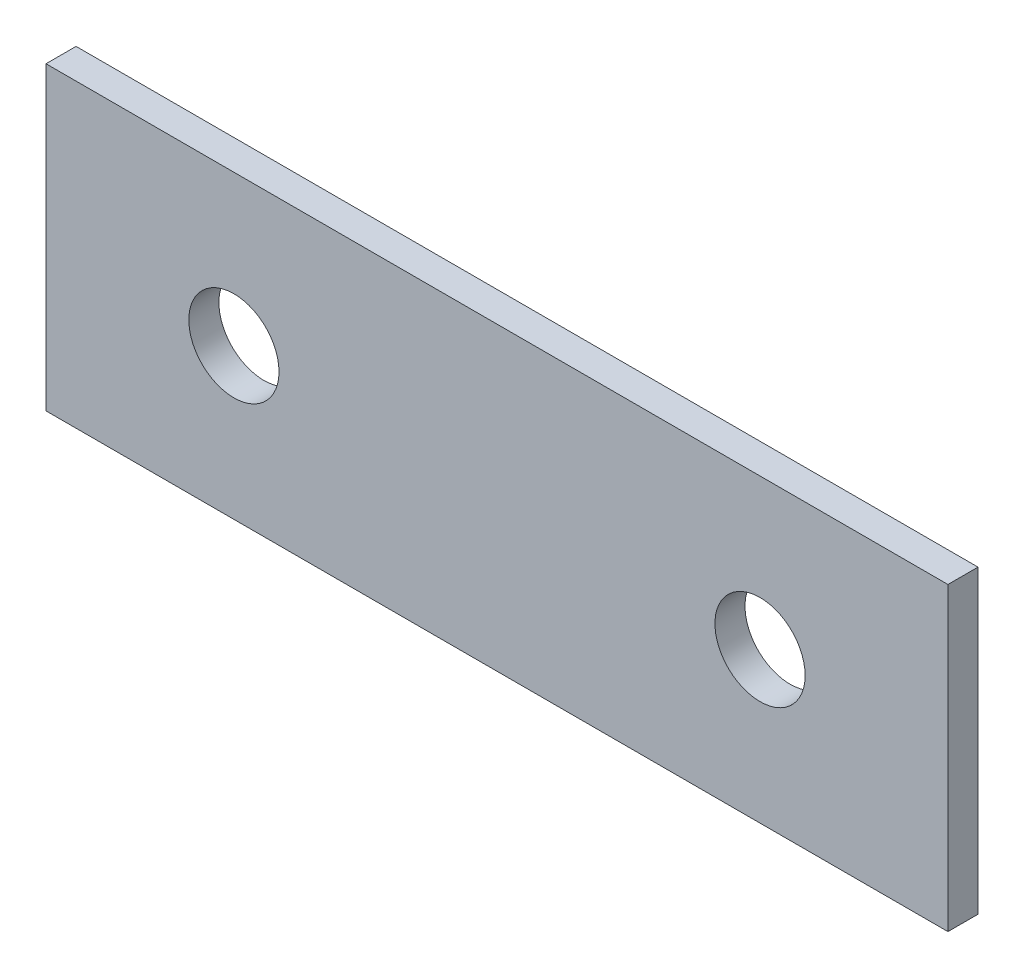
ISO-10303-21;
HEADER;
FILE_DESCRIPTION(('STEP AP214'),'2;1');
FILE_NAME('part.step','',(''),(''),'','','');
FILE_SCHEMA(('AUTOMOTIVE_DESIGN { 1 0 10303 214 1 1 1 1 }'));
ENDSEC;
DATA;
#1=APPLICATION_CONTEXT('core data for automotive mechanical design processes');
#2=APPLICATION_PROTOCOL_DEFINITION('international standard','automotive_design',2000,#1);
#3=PRODUCT_CONTEXT('',#1,'mechanical');
#4=PRODUCT('Part','Part','',(#3));
#5=PRODUCT_RELATED_PRODUCT_CATEGORY('part','',(#4));
#6=PRODUCT_DEFINITION_FORMATION('','',#4);
#7=PRODUCT_DEFINITION_CONTEXT('part definition',#1,'design');
#8=PRODUCT_DEFINITION('design','',#6,#7);
#9=PRODUCT_DEFINITION_SHAPE('','',#8);
#10=(LENGTH_UNIT() NAMED_UNIT(*) SI_UNIT(.MILLI.,.METRE.));
#11=(NAMED_UNIT(*) PLANE_ANGLE_UNIT() SI_UNIT($,.RADIAN.));
#12=(NAMED_UNIT(*) SI_UNIT($,.STERADIAN.) SOLID_ANGLE_UNIT());
#13=UNCERTAINTY_MEASURE_WITH_UNIT(LENGTH_MEASURE(1.E-05),#10,'distance_accuracy_value','');
#14=(GEOMETRIC_REPRESENTATION_CONTEXT(3) GLOBAL_UNCERTAINTY_ASSIGNED_CONTEXT((#13)) GLOBAL_UNIT_ASSIGNED_CONTEXT((#10,
#11,#12)) REPRESENTATION_CONTEXT('',''));
#15=CARTESIAN_POINT('',(0.,0.,0.));
#16=DIRECTION('',(0.,0.,1.));
#17=DIRECTION('',(1.,0.,0.));
#18=AXIS2_PLACEMENT_3D('',#15,#16,#17);
#19=CARTESIAN_POINT('',(-15.,-5.,1.));
#20=DIRECTION('',(0.,0.,1.));
#21=DIRECTION('',(1.,0.,0.));
#22=AXIS2_PLACEMENT_3D('',#19,#20,#21);
#23=PLANE('',#22);
#24=CARTESIAN_POINT('',(-8.75,0.,1.));
#25=DIRECTION('',(0.,0.,1.));
#26=DIRECTION('',(1.,0.,0.));
#27=AXIS2_PLACEMENT_3D('',#24,#25,#26);
#28=CIRCLE('',#27,1.5);
#29=CARTESIAN_POINT('',(-7.25,0.,1.));
#30=VERTEX_POINT('',#29);
#31=EDGE_CURVE('E98',#30,#30,#28,.T.);
#32=ORIENTED_EDGE('',*,*,#31,.F.);
#33=EDGE_LOOP('',(#32));
#34=FACE_BOUND('',#33,.T.);
#35=DIRECTION('',(0.,-1.,0.));
#36=VECTOR('',#35,1.);
#37=CARTESIAN_POINT('',(-15.,5.,1.));
#38=LINE('',#37,#36);
#39=CARTESIAN_POINT('',(-15.,5.,1.));
#40=VERTEX_POINT('',#39);
#41=CARTESIAN_POINT('',(-15.,-5.,1.));
#42=VERTEX_POINT('',#41);
#43=EDGE_CURVE('E83',#40,#42,#38,.T.);
#44=ORIENTED_EDGE('',*,*,#43,.T.);
#45=DIRECTION('',(1.,0.,0.));
#46=VECTOR('',#45,1.);
#47=CARTESIAN_POINT('',(-15.,-5.,1.));
#48=LINE('',#47,#46);
#49=CARTESIAN_POINT('',(15.,-5.,1.));
#50=VERTEX_POINT('',#49);
#51=EDGE_CURVE('E78',#42,#50,#48,.T.);
#52=ORIENTED_EDGE('',*,*,#51,.T.);
#53=DIRECTION('',(0.,1.,0.));
#54=VECTOR('',#53,1.);
#55=CARTESIAN_POINT('',(15.,5.,1.));
#56=LINE('',#55,#54);
#57=CARTESIAN_POINT('',(15.,5.,1.));
#58=VERTEX_POINT('',#57);
#59=EDGE_CURVE('E81',#50,#58,#56,.T.);
#60=ORIENTED_EDGE('',*,*,#59,.T.);
#61=DIRECTION('',(-1.,0.,0.));
#62=VECTOR('',#61,1.);
#63=CARTESIAN_POINT('',(-15.,5.,1.));
#64=LINE('',#63,#62);
#65=EDGE_CURVE('E48',#58,#40,#64,.T.);
#66=ORIENTED_EDGE('',*,*,#65,.T.);
#67=EDGE_LOOP('',(#44,#52,#60,#66));
#68=FACE_BOUND('',#67,.T.);
#69=CARTESIAN_POINT('',(8.75,0.,1.));
#70=DIRECTION('',(0.,0.,1.));
#71=DIRECTION('',(1.,0.,0.));
#72=AXIS2_PLACEMENT_3D('',#69,#70,#71);
#73=CIRCLE('',#72,1.5);
#74=CARTESIAN_POINT('',(10.25,0.,1.));
#75=VERTEX_POINT('',#74);
#76=EDGE_CURVE('E113',#75,#75,#73,.T.);
#77=ORIENTED_EDGE('',*,*,#76,.F.);
#78=EDGE_LOOP('',(#77));
#79=FACE_BOUND('',#78,.T.);
#80=ADVANCED_FACE('F31',(#34,#68,#79),#23,.T.);
#81=CARTESIAN_POINT('',(-15.,-5.,0.));
#82=DIRECTION('',(0.,0.,1.));
#83=DIRECTION('',(1.,0.,0.));
#84=AXIS2_PLACEMENT_3D('',#81,#82,#83);
#85=PLANE('',#84);
#86=CARTESIAN_POINT('',(-8.75,0.,0.));
#87=DIRECTION('',(0.,0.,1.));
#88=DIRECTION('',(1.,0.,0.));
#89=AXIS2_PLACEMENT_3D('',#86,#87,#88);
#90=CIRCLE('',#89,1.5);
#91=CARTESIAN_POINT('',(-7.25,0.,0.));
#92=VERTEX_POINT('',#91);
#93=EDGE_CURVE('E110',#92,#92,#90,.T.);
#94=ORIENTED_EDGE('',*,*,#93,.T.);
#95=EDGE_LOOP('',(#94));
#96=FACE_BOUND('',#95,.T.);
#97=DIRECTION('',(0.,-1.,0.));
#98=VECTOR('',#97,1.);
#99=CARTESIAN_POINT('',(-15.,5.,0.));
#100=LINE('',#99,#98);
#101=CARTESIAN_POINT('',(-15.,5.,0.));
#102=VERTEX_POINT('',#101);
#103=CARTESIAN_POINT('',(-15.,-5.,0.));
#104=VERTEX_POINT('',#103);
#105=EDGE_CURVE('E95',#102,#104,#100,.T.);
#106=ORIENTED_EDGE('',*,*,#105,.F.);
#107=DIRECTION('',(-1.,0.,0.));
#108=VECTOR('',#107,1.);
#109=CARTESIAN_POINT('',(-15.,5.,0.));
#110=LINE('',#109,#108);
#111=CARTESIAN_POINT('',(15.,5.,0.));
#112=VERTEX_POINT('',#111);
#113=EDGE_CURVE('E71',#112,#102,#110,.T.);
#114=ORIENTED_EDGE('',*,*,#113,.F.);
#115=DIRECTION('',(0.,1.,0.));
#116=VECTOR('',#115,1.);
#117=CARTESIAN_POINT('',(15.,5.,0.));
#118=LINE('',#117,#116);
#119=CARTESIAN_POINT('',(15.,-5.,0.));
#120=VERTEX_POINT('',#119);
#121=EDGE_CURVE('E65',#120,#112,#118,.T.);
#122=ORIENTED_EDGE('',*,*,#121,.F.);
#123=DIRECTION('',(1.,0.,0.));
#124=VECTOR('',#123,1.);
#125=CARTESIAN_POINT('',(-15.,-5.,0.));
#126=LINE('',#125,#124);
#127=EDGE_CURVE('E87',#104,#120,#126,.T.);
#128=ORIENTED_EDGE('',*,*,#127,.F.);
#129=EDGE_LOOP('',(#106,#114,#122,#128));
#130=FACE_BOUND('',#129,.T.);
#131=CARTESIAN_POINT('',(8.75,0.,0.));
#132=DIRECTION('',(0.,0.,1.));
#133=DIRECTION('',(1.,0.,0.));
#134=AXIS2_PLACEMENT_3D('',#131,#132,#133);
#135=CIRCLE('',#134,1.5);
#136=CARTESIAN_POINT('',(10.25,0.,0.));
#137=VERTEX_POINT('',#136);
#138=EDGE_CURVE('E116',#137,#137,#135,.T.);
#139=ORIENTED_EDGE('',*,*,#138,.T.);
#140=EDGE_LOOP('',(#139));
#141=FACE_BOUND('',#140,.T.);
#142=ADVANCED_FACE('F106',(#96,#130,#141),#85,.F.);
#143=CARTESIAN_POINT('',(-15.,5.,1.));
#144=DIRECTION('',(1.,0.,0.));
#145=DIRECTION('',(0.,0.,-1.));
#146=AXIS2_PLACEMENT_3D('',#143,#144,#145);
#147=PLANE('',#146);
#148=ORIENTED_EDGE('',*,*,#105,.T.);
#149=DIRECTION('',(0.,0.,-1.));
#150=VECTOR('',#149,1.);
#151=CARTESIAN_POINT('',(-15.,-5.,1.));
#152=LINE('',#151,#150);
#153=EDGE_CURVE('E11',#42,#104,#152,.T.);
#154=ORIENTED_EDGE('',*,*,#153,.F.);
#155=ORIENTED_EDGE('',*,*,#43,.F.);
#156=DIRECTION('',(0.,0.,-1.));
#157=VECTOR('',#156,1.);
#158=CARTESIAN_POINT('',(-15.,5.,1.));
#159=LINE('',#158,#157);
#160=EDGE_CURVE('E91',#40,#102,#159,.T.);
#161=ORIENTED_EDGE('',*,*,#160,.T.);
#162=EDGE_LOOP('',(#148,#154,#155,#161));
#163=FACE_BOUND('',#162,.T.);
#164=ADVANCED_FACE('F33',(#163),#147,.F.);
#165=CARTESIAN_POINT('',(-15.,-5.,1.));
#166=DIRECTION('',(0.,1.,0.));
#167=DIRECTION('',(0.,0.,1.));
#168=AXIS2_PLACEMENT_3D('',#165,#166,#167);
#169=PLANE('',#168);
#170=ORIENTED_EDGE('',*,*,#127,.T.);
#171=DIRECTION('',(0.,0.,-1.));
#172=VECTOR('',#171,1.);
#173=CARTESIAN_POINT('',(15.,-5.,1.));
#174=LINE('',#173,#172);
#175=EDGE_CURVE('E40',#50,#120,#174,.T.);
#176=ORIENTED_EDGE('',*,*,#175,.F.);
#177=ORIENTED_EDGE('',*,*,#51,.F.);
#178=ORIENTED_EDGE('',*,*,#153,.T.);
#179=EDGE_LOOP('',(#170,#176,#177,#178));
#180=FACE_BOUND('',#179,.T.);
#181=ADVANCED_FACE('F86',(#180),#169,.F.);
#182=CARTESIAN_POINT('',(15.,5.,1.));
#183=DIRECTION('',(-1.,0.,0.));
#184=DIRECTION('',(0.,-1.,0.));
#185=AXIS2_PLACEMENT_3D('',#182,#183,#184);
#186=PLANE('',#185);
#187=ORIENTED_EDGE('',*,*,#121,.T.);
#188=DIRECTION('',(0.,0.,-1.));
#189=VECTOR('',#188,1.);
#190=CARTESIAN_POINT('',(15.,5.,1.));
#191=LINE('',#190,#189);
#192=EDGE_CURVE('E88',#58,#112,#191,.T.);
#193=ORIENTED_EDGE('',*,*,#192,.F.);
#194=ORIENTED_EDGE('',*,*,#59,.F.);
#195=ORIENTED_EDGE('',*,*,#175,.T.);
#196=EDGE_LOOP('',(#187,#193,#194,#195));
#197=FACE_BOUND('',#196,.T.);
#198=ADVANCED_FACE('F89',(#197),#186,.F.);
#199=CARTESIAN_POINT('',(-15.,5.,1.));
#200=DIRECTION('',(0.,-1.,0.));
#201=DIRECTION('',(0.,0.,-1.));
#202=AXIS2_PLACEMENT_3D('',#199,#200,#201);
#203=PLANE('',#202);
#204=ORIENTED_EDGE('',*,*,#113,.T.);
#205=ORIENTED_EDGE('',*,*,#160,.F.);
#206=ORIENTED_EDGE('',*,*,#65,.F.);
#207=ORIENTED_EDGE('',*,*,#192,.T.);
#208=EDGE_LOOP('',(#204,#205,#206,#207));
#209=FACE_BOUND('',#208,.T.);
#210=ADVANCED_FACE('F103',(#209),#203,.F.);
#211=CARTESIAN_POINT('',(-8.75,0.,1.));
#212=DIRECTION('',(0.,0.,-1.));
#213=DIRECTION('',(-1.,0.,0.));
#214=AXIS2_PLACEMENT_3D('',#211,#212,#213);
#215=CYLINDRICAL_SURFACE('',#214,1.5);
#216=ORIENTED_EDGE('',*,*,#31,.T.);
#217=EDGE_LOOP('',(#216));
#218=FACE_BOUND('',#217,.T.);
#219=ORIENTED_EDGE('',*,*,#93,.F.);
#220=EDGE_LOOP('',(#219));
#221=FACE_BOUND('',#220,.T.);
#222=ADVANCED_FACE('F134',(#218,#221),#215,.F.);
#223=CARTESIAN_POINT('',(8.75,0.,1.));
#224=DIRECTION('',(0.,0.,-1.));
#225=DIRECTION('',(-1.,0.,0.));
#226=AXIS2_PLACEMENT_3D('',#223,#224,#225);
#227=CYLINDRICAL_SURFACE('',#226,1.5);
#228=ORIENTED_EDGE('',*,*,#76,.T.);
#229=EDGE_LOOP('',(#228));
#230=FACE_BOUND('',#229,.T.);
#231=ORIENTED_EDGE('',*,*,#138,.F.);
#232=EDGE_LOOP('',(#231));
#233=FACE_BOUND('',#232,.T.);
#234=ADVANCED_FACE('F122',(#230,#233),#227,.F.);
#235=CLOSED_SHELL('',(#80,#142,#164,#181,#198,#210,#222,#234));
#236=MANIFOLD_SOLID_BREP('B2',#235);
#237=ADVANCED_BREP_SHAPE_REPRESENTATION('',(#18,#236),#14);
#238=SHAPE_DEFINITION_REPRESENTATION(#9,#237);
ENDSEC;
END-ISO-10303-21;
